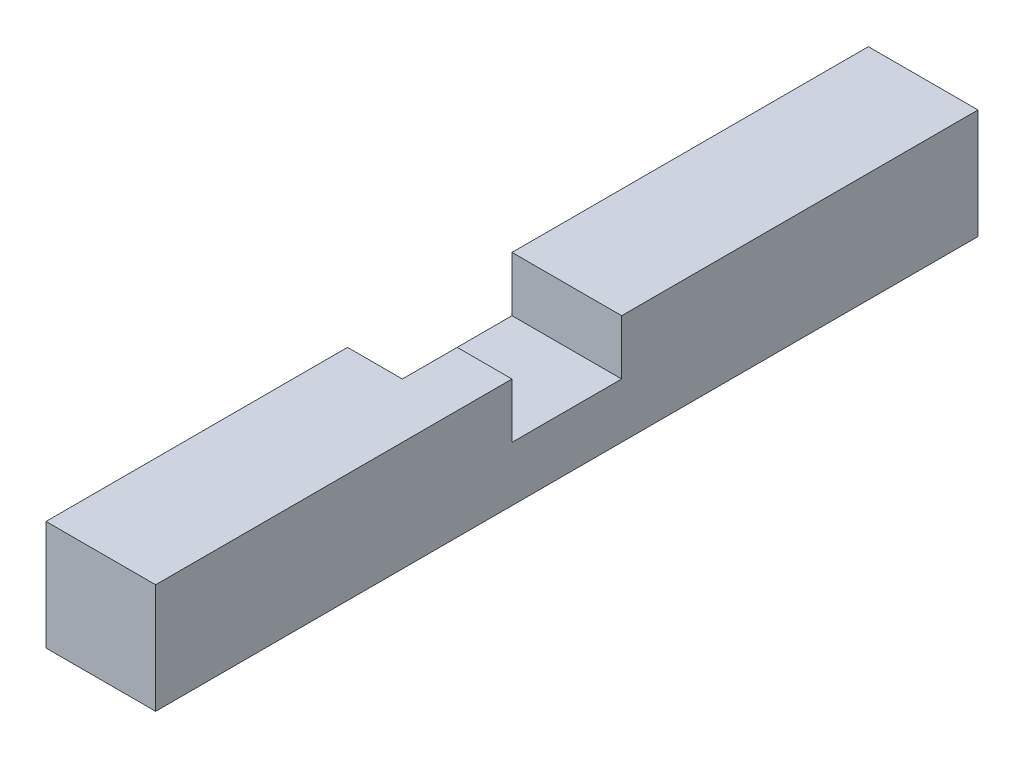
ISO-10303-21;
HEADER;
FILE_DESCRIPTION(('STEP AP214'),'2;1');
FILE_NAME('part.step','',(''),(''),'','','');
FILE_SCHEMA(('AUTOMOTIVE_DESIGN { 1 0 10303 214 1 1 1 1 }'));
ENDSEC;
DATA;
#1=APPLICATION_CONTEXT('core data for automotive mechanical design processes');
#2=APPLICATION_PROTOCOL_DEFINITION('international standard','automotive_design',2000,#1);
#3=PRODUCT_CONTEXT('',#1,'mechanical');
#4=PRODUCT('Part','Part','',(#3));
#5=PRODUCT_RELATED_PRODUCT_CATEGORY('part','',(#4));
#6=PRODUCT_DEFINITION_FORMATION('','',#4);
#7=PRODUCT_DEFINITION_CONTEXT('part definition',#1,'design');
#8=PRODUCT_DEFINITION('design','',#6,#7);
#9=PRODUCT_DEFINITION_SHAPE('','',#8);
#10=(LENGTH_UNIT() NAMED_UNIT(*) SI_UNIT(.MILLI.,.METRE.));
#11=(NAMED_UNIT(*) PLANE_ANGLE_UNIT() SI_UNIT($,.RADIAN.));
#12=(NAMED_UNIT(*) SI_UNIT($,.STERADIAN.) SOLID_ANGLE_UNIT());
#13=UNCERTAINTY_MEASURE_WITH_UNIT(LENGTH_MEASURE(1.E-05),#10,'distance_accuracy_value','');
#14=(GEOMETRIC_REPRESENTATION_CONTEXT(3) GLOBAL_UNCERTAINTY_ASSIGNED_CONTEXT((#13)) GLOBAL_UNIT_ASSIGNED_CONTEXT((#10,
#11,#12)) REPRESENTATION_CONTEXT('',''));
#15=CARTESIAN_POINT('',(0.,0.,0.));
#16=DIRECTION('',(0.,0.,1.));
#17=DIRECTION('',(1.,0.,0.));
#18=AXIS2_PLACEMENT_3D('',#15,#16,#17);
#19=CARTESIAN_POINT('',(-2.,2.,30.));
#20=DIRECTION('',(1.,0.,0.));
#21=DIRECTION('',(0.,1.,0.));
#22=AXIS2_PLACEMENT_3D('',#19,#20,#21);
#23=PLANE('',#22);
#24=DIRECTION('',(0.,-1.,0.));
#25=VECTOR('',#24,1.);
#26=CARTESIAN_POINT('',(-2.,2.,19.));
#27=LINE('',#26,#25);
#28=CARTESIAN_POINT('',(-2.,2.,19.));
#29=VERTEX_POINT('',#28);
#30=CARTESIAN_POINT('',(-2.,-2.,19.));
#31=VERTEX_POINT('',#30);
#32=EDGE_CURVE('E138',#29,#31,#27,.T.);
#33=ORIENTED_EDGE('',*,*,#32,.T.);
#34=DIRECTION('',(0.,0.,-1.));
#35=VECTOR('',#34,1.);
#36=CARTESIAN_POINT('',(-2.,-2.,30.));
#37=LINE('',#36,#35);
#38=CARTESIAN_POINT('',(-2.,-2.,30.));
#39=VERTEX_POINT('',#38);
#40=EDGE_CURVE('E208',#39,#31,#37,.T.);
#41=ORIENTED_EDGE('',*,*,#40,.F.);
#42=DIRECTION('',(0.,-1.,0.));
#43=VECTOR('',#42,1.);
#44=CARTESIAN_POINT('',(-2.,2.,30.));
#45=LINE('',#44,#43);
#46=CARTESIAN_POINT('',(-2.,2.,30.));
#47=VERTEX_POINT('',#46);
#48=EDGE_CURVE('E191',#47,#39,#45,.T.);
#49=ORIENTED_EDGE('',*,*,#48,.F.);
#50=DIRECTION('',(0.,0.,-1.));
#51=VECTOR('',#50,1.);
#52=CARTESIAN_POINT('',(-2.,2.,30.));
#53=LINE('',#52,#51);
#54=EDGE_CURVE('E211',#47,#29,#53,.T.);
#55=ORIENTED_EDGE('',*,*,#54,.T.);
#56=EDGE_LOOP('',(#33,#41,#49,#55));
#57=FACE_BOUND('',#56,.T.);
#58=ADVANCED_FACE('F35',(#57),#23,.F.);
#59=CARTESIAN_POINT('',(-2.,-2.,30.));
#60=DIRECTION('',(0.,1.,0.));
#61=DIRECTION('',(0.,0.,1.));
#62=AXIS2_PLACEMENT_3D('',#59,#60,#61);
#63=PLANE('',#62);
#64=DIRECTION('',(-1.,0.,0.));
#65=VECTOR('',#64,1.);
#66=CARTESIAN_POINT('',(0.,-2.,19.));
#67=LINE('',#66,#65);
#68=CARTESIAN_POINT('',(0.,-2.,19.));
#69=VERTEX_POINT('',#68);
#70=EDGE_CURVE('E143',#69,#31,#67,.T.);
#71=ORIENTED_EDGE('',*,*,#70,.F.);
#72=DIRECTION('',(0.,0.,-1.));
#73=VECTOR('',#72,1.);
#74=CARTESIAN_POINT('',(0.,-2.,17.));
#75=LINE('',#74,#73);
#76=CARTESIAN_POINT('',(0.,-2.,15.));
#77=VERTEX_POINT('',#76);
#78=EDGE_CURVE('E130',#69,#77,#75,.T.);
#79=ORIENTED_EDGE('',*,*,#78,.T.);
#80=DIRECTION('',(-1.,0.,0.));
#81=VECTOR('',#80,1.);
#82=CARTESIAN_POINT('',(0.,-2.,15.));
#83=LINE('',#82,#81);
#84=CARTESIAN_POINT('',(-2.,-2.,15.));
#85=VERTEX_POINT('',#84);
#86=EDGE_CURVE('E160',#77,#85,#83,.T.);
#87=ORIENTED_EDGE('',*,*,#86,.T.);
#88=CARTESIAN_POINT('',(-2.,-2.,0.));
#89=VERTEX_POINT('',#88);
#90=EDGE_CURVE('E207',#85,#89,#37,.T.);
#91=ORIENTED_EDGE('',*,*,#90,.T.);
#92=DIRECTION('',(1.,0.,0.));
#93=VECTOR('',#92,1.);
#94=CARTESIAN_POINT('',(-2.,-2.,0.));
#95=LINE('',#94,#93);
#96=CARTESIAN_POINT('',(2.,-2.,0.));
#97=VERTEX_POINT('',#96);
#98=EDGE_CURVE('E189',#89,#97,#95,.T.);
#99=ORIENTED_EDGE('',*,*,#98,.T.);
#100=DIRECTION('',(0.,0.,-1.));
#101=VECTOR('',#100,1.);
#102=CARTESIAN_POINT('',(2.,-2.,30.));
#103=LINE('',#102,#101);
#104=CARTESIAN_POINT('',(2.,-2.,30.));
#105=VERTEX_POINT('',#104);
#106=EDGE_CURVE('E195',#105,#97,#103,.T.);
#107=ORIENTED_EDGE('',*,*,#106,.F.);
#108=DIRECTION('',(1.,0.,0.));
#109=VECTOR('',#108,1.);
#110=CARTESIAN_POINT('',(-2.,-2.,30.));
#111=LINE('',#110,#109);
#112=EDGE_CURVE('E193',#39,#105,#111,.T.);
#113=ORIENTED_EDGE('',*,*,#112,.F.);
#114=ORIENTED_EDGE('',*,*,#40,.T.);
#115=EDGE_LOOP('',(#71,#79,#87,#91,#99,#107,#113,#114));
#116=FACE_BOUND('',#115,.T.);
#117=ADVANCED_FACE('F231',(#116),#63,.F.);
#118=CARTESIAN_POINT('',(-2.,2.,30.));
#119=DIRECTION('',(0.,-1.,0.));
#120=DIRECTION('',(0.,0.,-1.));
#121=AXIS2_PLACEMENT_3D('',#118,#119,#120);
#122=PLANE('',#121);
#123=DIRECTION('',(-1.,0.,0.));
#124=VECTOR('',#123,1.);
#125=CARTESIAN_POINT('',(0.,2.,19.));
#126=LINE('',#125,#124);
#127=CARTESIAN_POINT('',(0.,2.,19.));
#128=VERTEX_POINT('',#127);
#129=EDGE_CURVE('E135',#128,#29,#126,.T.);
#130=ORIENTED_EDGE('',*,*,#129,.T.);
#131=ORIENTED_EDGE('',*,*,#54,.F.);
#132=DIRECTION('',(-1.,0.,0.));
#133=VECTOR('',#132,1.);
#134=CARTESIAN_POINT('',(-2.,2.,30.));
#135=LINE('',#134,#133);
#136=CARTESIAN_POINT('',(2.,2.,30.));
#137=VERTEX_POINT('',#136);
#138=EDGE_CURVE('E188',#137,#47,#135,.T.);
#139=ORIENTED_EDGE('',*,*,#138,.F.);
#140=DIRECTION('',(0.,0.,-1.));
#141=VECTOR('',#140,1.);
#142=CARTESIAN_POINT('',(2.,2.,30.));
#143=LINE('',#142,#141);
#144=CARTESIAN_POINT('',(2.,2.,17.));
#145=VERTEX_POINT('',#144);
#146=EDGE_CURVE('E11',#137,#145,#143,.T.);
#147=ORIENTED_EDGE('',*,*,#146,.T.);
#148=DIRECTION('',(-1.,0.,0.));
#149=VECTOR('',#148,1.);
#150=CARTESIAN_POINT('',(2.,2.,17.));
#151=LINE('',#150,#149);
#152=CARTESIAN_POINT('',(0.,2.,17.));
#153=VERTEX_POINT('',#152);
#154=EDGE_CURVE('E147',#145,#153,#151,.T.);
#155=ORIENTED_EDGE('',*,*,#154,.T.);
#156=DIRECTION('',(0.,0.,1.));
#157=VECTOR('',#156,1.);
#158=CARTESIAN_POINT('',(0.,2.,17.));
#159=LINE('',#158,#157);
#160=EDGE_CURVE('E127',#153,#128,#159,.T.);
#161=ORIENTED_EDGE('',*,*,#160,.T.);
#162=EDGE_LOOP('',(#130,#131,#139,#147,#155,#161));
#163=FACE_BOUND('',#162,.T.);
#164=ADVANCED_FACE('F146',(#163),#122,.F.);
#165=CARTESIAN_POINT('',(2.,2.,30.));
#166=DIRECTION('',(-1.,0.,0.));
#167=DIRECTION('',(0.,-1.,0.));
#168=AXIS2_PLACEMENT_3D('',#165,#166,#167);
#169=PLANE('',#168);
#170=CARTESIAN_POINT('',(2.,2.,13.));
#171=VERTEX_POINT('',#170);
#172=CARTESIAN_POINT('',(2.,2.,0.));
#173=VERTEX_POINT('',#172);
#174=EDGE_CURVE('E43',#171,#173,#143,.T.);
#175=ORIENTED_EDGE('',*,*,#174,.F.);
#176=DIRECTION('',(0.,-1.,0.));
#177=VECTOR('',#176,1.);
#178=CARTESIAN_POINT('',(2.,2.,13.));
#179=LINE('',#178,#177);
#180=CARTESIAN_POINT('',(2.,0.,13.));
#181=VERTEX_POINT('',#180);
#182=EDGE_CURVE('E164',#171,#181,#179,.T.);
#183=ORIENTED_EDGE('',*,*,#182,.T.);
#184=DIRECTION('',(0.,0.,1.));
#185=VECTOR('',#184,1.);
#186=CARTESIAN_POINT('',(2.,0.,13.));
#187=LINE('',#186,#185);
#188=CARTESIAN_POINT('',(2.,0.,17.));
#189=VERTEX_POINT('',#188);
#190=EDGE_CURVE('E167',#181,#189,#187,.T.);
#191=ORIENTED_EDGE('',*,*,#190,.T.);
#192=DIRECTION('',(0.,-1.,0.));
#193=VECTOR('',#192,1.);
#194=CARTESIAN_POINT('',(2.,2.,17.));
#195=LINE('',#194,#193);
#196=EDGE_CURVE('E171',#145,#189,#195,.T.);
#197=ORIENTED_EDGE('',*,*,#196,.F.);
#198=ORIENTED_EDGE('',*,*,#146,.F.);
#199=DIRECTION('',(0.,1.,0.));
#200=VECTOR('',#199,1.);
#201=CARTESIAN_POINT('',(2.,2.,30.));
#202=LINE('',#201,#200);
#203=EDGE_CURVE('E185',#105,#137,#202,.T.);
#204=ORIENTED_EDGE('',*,*,#203,.F.);
#205=ORIENTED_EDGE('',*,*,#106,.T.);
#206=DIRECTION('',(0.,1.,0.));
#207=VECTOR('',#206,1.);
#208=CARTESIAN_POINT('',(2.,2.,0.));
#209=LINE('',#208,#207);
#210=EDGE_CURVE('E179',#97,#173,#209,.T.);
#211=ORIENTED_EDGE('',*,*,#210,.T.);
#212=EDGE_LOOP('',(#175,#183,#191,#197,#198,#204,#205,#211));
#213=FACE_BOUND('',#212,.T.);
#214=ADVANCED_FACE('F37',(#213),#169,.F.);
#215=CARTESIAN_POINT('',(-2.,2.,13.));
#216=VERTEX_POINT('',#215);
#217=CARTESIAN_POINT('',(-2.,2.,0.));
#218=VERTEX_POINT('',#217);
#219=EDGE_CURVE('E210',#216,#218,#53,.T.);
#220=ORIENTED_EDGE('',*,*,#219,.F.);
#221=DIRECTION('',(-1.,0.,0.));
#222=VECTOR('',#221,1.);
#223=CARTESIAN_POINT('',(2.,2.,13.));
#224=LINE('',#223,#222);
#225=EDGE_CURVE('E177',#171,#216,#224,.T.);
#226=ORIENTED_EDGE('',*,*,#225,.F.);
#227=ORIENTED_EDGE('',*,*,#174,.T.);
#228=DIRECTION('',(-1.,0.,0.));
#229=VECTOR('',#228,1.);
#230=CARTESIAN_POINT('',(-2.,2.,0.));
#231=LINE('',#230,#229);
#232=EDGE_CURVE('E198',#173,#218,#231,.T.);
#233=ORIENTED_EDGE('',*,*,#232,.T.);
#234=EDGE_LOOP('',(#220,#226,#227,#233));
#235=FACE_BOUND('',#234,.T.);
#236=ADVANCED_FACE('F224',(#235),#122,.F.);
#237=ORIENTED_EDGE('',*,*,#90,.F.);
#238=DIRECTION('',(0.,-1.,0.));
#239=VECTOR('',#238,1.);
#240=CARTESIAN_POINT('',(-2.,0.,15.));
#241=LINE('',#240,#239);
#242=CARTESIAN_POINT('',(-2.,0.,15.));
#243=VERTEX_POINT('',#242);
#244=EDGE_CURVE('E142',#243,#85,#241,.T.);
#245=ORIENTED_EDGE('',*,*,#244,.F.);
#246=DIRECTION('',(0.,0.,1.));
#247=VECTOR('',#246,1.);
#248=CARTESIAN_POINT('',(-2.,0.,13.));
#249=LINE('',#248,#247);
#250=CARTESIAN_POINT('',(-2.,0.,13.));
#251=VERTEX_POINT('',#250);
#252=EDGE_CURVE('E168',#251,#243,#249,.T.);
#253=ORIENTED_EDGE('',*,*,#252,.F.);
#254=DIRECTION('',(0.,-1.,0.));
#255=VECTOR('',#254,1.);
#256=CARTESIAN_POINT('',(-2.,2.,13.));
#257=LINE('',#256,#255);
#258=EDGE_CURVE('E58',#216,#251,#257,.T.);
#259=ORIENTED_EDGE('',*,*,#258,.F.);
#260=ORIENTED_EDGE('',*,*,#219,.T.);
#261=DIRECTION('',(0.,-1.,0.));
#262=VECTOR('',#261,1.);
#263=CARTESIAN_POINT('',(-2.,2.,0.));
#264=LINE('',#263,#262);
#265=EDGE_CURVE('E201',#218,#89,#264,.T.);
#266=ORIENTED_EDGE('',*,*,#265,.T.);
#267=EDGE_LOOP('',(#237,#245,#253,#259,#260,#266));
#268=FACE_BOUND('',#267,.T.);
#269=ADVANCED_FACE('F217',(#268),#23,.F.);
#270=CARTESIAN_POINT('',(0.,0.,30.));
#271=DIRECTION('',(0.,0.,1.));
#272=DIRECTION('',(1.,0.,0.));
#273=AXIS2_PLACEMENT_3D('',#270,#271,#272);
#274=PLANE('',#273);
#275=ORIENTED_EDGE('',*,*,#203,.T.);
#276=ORIENTED_EDGE('',*,*,#138,.T.);
#277=ORIENTED_EDGE('',*,*,#48,.T.);
#278=ORIENTED_EDGE('',*,*,#112,.T.);
#279=EDGE_LOOP('',(#275,#276,#277,#278));
#280=FACE_BOUND('',#279,.T.);
#281=ADVANCED_FACE('F238',(#280),#274,.T.);
#282=CARTESIAN_POINT('',(0.,0.,0.));
#283=DIRECTION('',(0.,0.,1.));
#284=DIRECTION('',(1.,0.,0.));
#285=AXIS2_PLACEMENT_3D('',#282,#283,#284);
#286=PLANE('',#285);
#287=ORIENTED_EDGE('',*,*,#210,.F.);
#288=ORIENTED_EDGE('',*,*,#98,.F.);
#289=ORIENTED_EDGE('',*,*,#265,.F.);
#290=ORIENTED_EDGE('',*,*,#232,.F.);
#291=EDGE_LOOP('',(#287,#288,#289,#290));
#292=FACE_BOUND('',#291,.T.);
#293=ADVANCED_FACE('F228',(#292),#286,.F.);
#294=CARTESIAN_POINT('',(2.,2.,13.));
#295=DIRECTION('',(0.,0.,-1.));
#296=DIRECTION('',(-1.,0.,0.));
#297=AXIS2_PLACEMENT_3D('',#294,#295,#296);
#298=PLANE('',#297);
#299=ORIENTED_EDGE('',*,*,#258,.T.);
#300=DIRECTION('',(-1.,0.,0.));
#301=VECTOR('',#300,1.);
#302=CARTESIAN_POINT('',(2.,0.,13.));
#303=LINE('',#302,#301);
#304=EDGE_CURVE('E173',#181,#251,#303,.T.);
#305=ORIENTED_EDGE('',*,*,#304,.F.);
#306=ORIENTED_EDGE('',*,*,#182,.F.);
#307=ORIENTED_EDGE('',*,*,#225,.T.);
#308=EDGE_LOOP('',(#299,#305,#306,#307));
#309=FACE_BOUND('',#308,.T.);
#310=ADVANCED_FACE('F280',(#309),#298,.F.);
#311=CARTESIAN_POINT('',(2.,2.,17.));
#312=DIRECTION('',(0.,0.,-1.));
#313=DIRECTION('',(-1.,0.,0.));
#314=AXIS2_PLACEMENT_3D('',#311,#312,#313);
#315=PLANE('',#314);
#316=DIRECTION('',(0.,-1.,0.));
#317=VECTOR('',#316,1.);
#318=CARTESIAN_POINT('',(0.,2.,17.));
#319=LINE('',#318,#317);
#320=CARTESIAN_POINT('',(0.,0.,17.));
#321=VERTEX_POINT('',#320);
#322=EDGE_CURVE('E50',#153,#321,#319,.T.);
#323=ORIENTED_EDGE('',*,*,#322,.F.);
#324=ORIENTED_EDGE('',*,*,#154,.F.);
#325=ORIENTED_EDGE('',*,*,#196,.T.);
#326=DIRECTION('',(-1.,0.,0.));
#327=VECTOR('',#326,1.);
#328=CARTESIAN_POINT('',(2.,0.,17.));
#329=LINE('',#328,#327);
#330=EDGE_CURVE('E181',#189,#321,#329,.T.);
#331=ORIENTED_EDGE('',*,*,#330,.T.);
#332=EDGE_LOOP('',(#323,#324,#325,#331));
#333=FACE_BOUND('',#332,.T.);
#334=ADVANCED_FACE('F284',(#333),#315,.T.);
#335=CARTESIAN_POINT('',(2.,0.,13.));
#336=DIRECTION('',(0.,-1.,0.));
#337=DIRECTION('',(1.,0.,0.));
#338=AXIS2_PLACEMENT_3D('',#335,#336,#337);
#339=PLANE('',#338);
#340=ORIENTED_EDGE('',*,*,#252,.T.);
#341=DIRECTION('',(-1.,0.,0.));
#342=VECTOR('',#341,1.);
#343=CARTESIAN_POINT('',(0.,0.,15.));
#344=LINE('',#343,#342);
#345=CARTESIAN_POINT('',(0.,0.,15.));
#346=VERTEX_POINT('',#345);
#347=EDGE_CURVE('E158',#346,#243,#344,.T.);
#348=ORIENTED_EDGE('',*,*,#347,.F.);
#349=DIRECTION('',(0.,0.,-1.));
#350=VECTOR('',#349,1.);
#351=CARTESIAN_POINT('',(0.,0.,17.));
#352=LINE('',#351,#350);
#353=EDGE_CURVE('E153',#321,#346,#352,.T.);
#354=ORIENTED_EDGE('',*,*,#353,.F.);
#355=ORIENTED_EDGE('',*,*,#330,.F.);
#356=ORIENTED_EDGE('',*,*,#190,.F.);
#357=ORIENTED_EDGE('',*,*,#304,.T.);
#358=EDGE_LOOP('',(#340,#348,#354,#355,#356,#357));
#359=FACE_BOUND('',#358,.T.);
#360=ADVANCED_FACE('F300',(#359),#339,.F.);
#361=CARTESIAN_POINT('',(0.,0.,15.));
#362=DIRECTION('',(0.,0.,-1.));
#363=DIRECTION('',(-1.,0.,0.));
#364=AXIS2_PLACEMENT_3D('',#361,#362,#363);
#365=PLANE('',#364);
#366=ORIENTED_EDGE('',*,*,#244,.T.);
#367=ORIENTED_EDGE('',*,*,#86,.F.);
#368=DIRECTION('',(0.,-1.,0.));
#369=VECTOR('',#368,1.);
#370=CARTESIAN_POINT('',(0.,0.,15.));
#371=LINE('',#370,#369);
#372=EDGE_CURVE('E155',#346,#77,#371,.T.);
#373=ORIENTED_EDGE('',*,*,#372,.F.);
#374=ORIENTED_EDGE('',*,*,#347,.T.);
#375=EDGE_LOOP('',(#366,#367,#373,#374));
#376=FACE_BOUND('',#375,.T.);
#377=ADVANCED_FACE('F296',(#376),#365,.F.);
#378=CARTESIAN_POINT('',(0.,0.,0.));
#379=DIRECTION('',(-1.,0.,0.));
#380=DIRECTION('',(0.,0.,1.));
#381=AXIS2_PLACEMENT_3D('',#378,#379,#380);
#382=PLANE('',#381);
#383=ORIENTED_EDGE('',*,*,#353,.T.);
#384=ORIENTED_EDGE('',*,*,#372,.T.);
#385=ORIENTED_EDGE('',*,*,#78,.F.);
#386=DIRECTION('',(0.,-1.,0.));
#387=VECTOR('',#386,1.);
#388=CARTESIAN_POINT('',(0.,2.,19.));
#389=LINE('',#388,#387);
#390=EDGE_CURVE('E123',#128,#69,#389,.T.);
#391=ORIENTED_EDGE('',*,*,#390,.F.);
#392=ORIENTED_EDGE('',*,*,#160,.F.);
#393=ORIENTED_EDGE('',*,*,#322,.T.);
#394=EDGE_LOOP('',(#383,#384,#385,#391,#392,#393));
#395=FACE_BOUND('',#394,.T.);
#396=ADVANCED_FACE('F125',(#395),#382,.T.);
#397=CARTESIAN_POINT('',(0.,2.,19.));
#398=DIRECTION('',(0.,0.,-1.));
#399=DIRECTION('',(-1.,0.,0.));
#400=AXIS2_PLACEMENT_3D('',#397,#398,#399);
#401=PLANE('',#400);
#402=ORIENTED_EDGE('',*,*,#32,.F.);
#403=ORIENTED_EDGE('',*,*,#129,.F.);
#404=ORIENTED_EDGE('',*,*,#390,.T.);
#405=ORIENTED_EDGE('',*,*,#70,.T.);
#406=EDGE_LOOP('',(#402,#403,#404,#405));
#407=FACE_BOUND('',#406,.T.);
#408=ADVANCED_FACE('F136',(#407),#401,.T.);
#409=CLOSED_SHELL('',(#58,#117,#164,#214,#236,#269,#281,#293,#310,#334,#360,#377,#396,#408));
#410=MANIFOLD_SOLID_BREP('B2',#409);
#411=ADVANCED_BREP_SHAPE_REPRESENTATION('',(#18,#410),#14);
#412=SHAPE_DEFINITION_REPRESENTATION(#9,#411);
ENDSEC;
END-ISO-10303-21;
